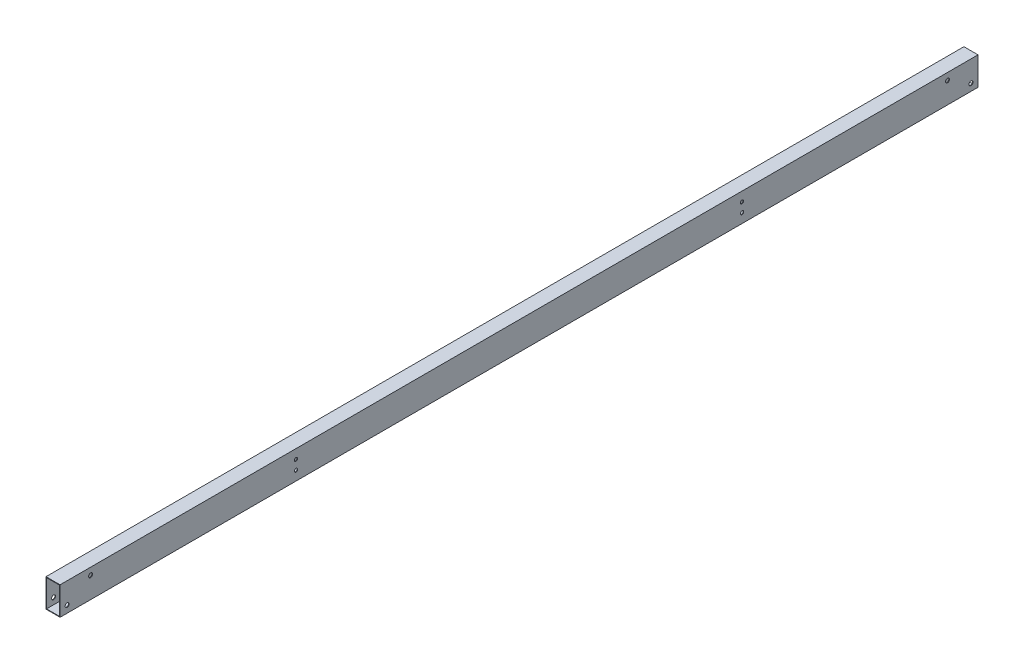
ISO-10303-21;
HEADER;
FILE_DESCRIPTION(('STEP AP214'),'2;1');
FILE_NAME('part.step','',(''),(''),'','','');
FILE_SCHEMA(('AUTOMOTIVE_DESIGN { 1 0 10303 214 1 1 1 1 }'));
ENDSEC;
DATA;
#1=APPLICATION_CONTEXT('core data for automotive mechanical design processes');
#2=APPLICATION_PROTOCOL_DEFINITION('international standard','automotive_design',2000,#1);
#3=PRODUCT_CONTEXT('',#1,'mechanical');
#4=PRODUCT('Part','Part','',(#3));
#5=PRODUCT_RELATED_PRODUCT_CATEGORY('part','',(#4));
#6=PRODUCT_DEFINITION_FORMATION('','',#4);
#7=PRODUCT_DEFINITION_CONTEXT('part definition',#1,'design');
#8=PRODUCT_DEFINITION('design','',#6,#7);
#9=PRODUCT_DEFINITION_SHAPE('','',#8);
#10=(LENGTH_UNIT() NAMED_UNIT(*) SI_UNIT(.MILLI.,.METRE.));
#11=(NAMED_UNIT(*) PLANE_ANGLE_UNIT() SI_UNIT($,.RADIAN.));
#12=(NAMED_UNIT(*) SI_UNIT($,.STERADIAN.) SOLID_ANGLE_UNIT());
#13=UNCERTAINTY_MEASURE_WITH_UNIT(LENGTH_MEASURE(1.E-05),#10,'distance_accuracy_value','');
#14=(GEOMETRIC_REPRESENTATION_CONTEXT(3) GLOBAL_UNCERTAINTY_ASSIGNED_CONTEXT((#13)) GLOBAL_UNIT_ASSIGNED_CONTEXT((#10,
#11,#12)) REPRESENTATION_CONTEXT('',''));
#15=CARTESIAN_POINT('',(0.,0.,0.));
#16=DIRECTION('',(0.,0.,1.));
#17=DIRECTION('',(1.,0.,0.));
#18=AXIS2_PLACEMENT_3D('',#15,#16,#17);
#19=CARTESIAN_POINT('',(0.,0.,1955.));
#20=DIRECTION('',(0.,0.,-1.));
#21=DIRECTION('',(-1.,0.,0.));
#22=AXIS2_PLACEMENT_3D('',#19,#20,#21);
#23=PLANE('',#22);
#24=DIRECTION('',(0.,-1.,0.));
#25=VECTOR('',#24,1.);
#26=CARTESIAN_POINT('',(0.,0.,1955.));
#27=LINE('',#26,#25);
#28=CARTESIAN_POINT('',(0.,60.,1955.));
#29=VERTEX_POINT('',#28);
#30=CARTESIAN_POINT('',(0.,0.,1955.));
#31=VERTEX_POINT('',#30);
#32=EDGE_CURVE('E138',#29,#31,#27,.T.);
#33=ORIENTED_EDGE('',*,*,#32,.T.);
#34=DIRECTION('',(1.,0.,0.));
#35=VECTOR('',#34,1.);
#36=CARTESIAN_POINT('',(0.,0.,1955.));
#37=LINE('',#36,#35);
#38=CARTESIAN_POINT('',(30.,0.,1955.));
#39=VERTEX_POINT('',#38);
#40=EDGE_CURVE('E141',#31,#39,#37,.T.);
#41=ORIENTED_EDGE('',*,*,#40,.T.);
#42=DIRECTION('',(0.,1.,0.));
#43=VECTOR('',#42,1.);
#44=CARTESIAN_POINT('',(30.,0.,1955.));
#45=LINE('',#44,#43);
#46=CARTESIAN_POINT('',(30.,60.,1955.));
#47=VERTEX_POINT('',#46);
#48=EDGE_CURVE('E144',#39,#47,#45,.T.);
#49=ORIENTED_EDGE('',*,*,#48,.T.);
#50=DIRECTION('',(-1.,0.,0.));
#51=VECTOR('',#50,1.);
#52=CARTESIAN_POINT('',(0.,60.,1955.));
#53=LINE('',#52,#51);
#54=EDGE_CURVE('E146',#47,#29,#53,.T.);
#55=ORIENTED_EDGE('',*,*,#54,.T.);
#56=EDGE_LOOP('',(#33,#41,#49,#55));
#57=FACE_BOUND('',#56,.T.);
#58=DIRECTION('',(0.,-1.,0.));
#59=VECTOR('',#58,1.);
#60=CARTESIAN_POINT('',(1.2,1.2,1955.));
#61=LINE('',#60,#59);
#62=CARTESIAN_POINT('',(1.2,58.8,1955.));
#63=VERTEX_POINT('',#62);
#64=CARTESIAN_POINT('',(1.2,1.2,1955.));
#65=VERTEX_POINT('',#64);
#66=EDGE_CURVE('E100',#63,#65,#61,.T.);
#67=ORIENTED_EDGE('',*,*,#66,.F.);
#68=DIRECTION('',(-1.,0.,0.));
#69=VECTOR('',#68,1.);
#70=CARTESIAN_POINT('',(1.2,58.8,1955.));
#71=LINE('',#70,#69);
#72=CARTESIAN_POINT('',(28.8,58.8,1955.));
#73=VERTEX_POINT('',#72);
#74=EDGE_CURVE('E122',#73,#63,#71,.T.);
#75=ORIENTED_EDGE('',*,*,#74,.F.);
#76=DIRECTION('',(0.,1.,0.));
#77=VECTOR('',#76,1.);
#78=CARTESIAN_POINT('',(28.8,1.2,1955.));
#79=LINE('',#78,#77);
#80=CARTESIAN_POINT('',(28.8,1.2,1955.));
#81=VERTEX_POINT('',#80);
#82=EDGE_CURVE('E120',#81,#73,#79,.T.);
#83=ORIENTED_EDGE('',*,*,#82,.F.);
#84=DIRECTION('',(1.,0.,0.));
#85=VECTOR('',#84,1.);
#86=CARTESIAN_POINT('',(1.2,1.2,1955.));
#87=LINE('',#86,#85);
#88=EDGE_CURVE('E108',#65,#81,#87,.T.);
#89=ORIENTED_EDGE('',*,*,#88,.F.);
#90=EDGE_LOOP('',(#67,#75,#83,#89));
#91=FACE_BOUND('',#90,.T.);
#92=ADVANCED_FACE('F33',(#57,#91),#23,.F.);
#93=CARTESIAN_POINT('',(0.,0.,0.));
#94=DIRECTION('',(0.,0.,-1.));
#95=DIRECTION('',(-1.,0.,0.));
#96=AXIS2_PLACEMENT_3D('',#93,#94,#95);
#97=PLANE('',#96);
#98=DIRECTION('',(0.,-1.,0.));
#99=VECTOR('',#98,1.);
#100=CARTESIAN_POINT('',(0.,0.,0.));
#101=LINE('',#100,#99);
#102=CARTESIAN_POINT('',(0.,60.,0.));
#103=VERTEX_POINT('',#102);
#104=CARTESIAN_POINT('',(0.,0.,0.));
#105=VERTEX_POINT('',#104);
#106=EDGE_CURVE('E116',#103,#105,#101,.T.);
#107=ORIENTED_EDGE('',*,*,#106,.F.);
#108=DIRECTION('',(-1.,0.,0.));
#109=VECTOR('',#108,1.);
#110=CARTESIAN_POINT('',(0.,60.,0.));
#111=LINE('',#110,#109);
#112=CARTESIAN_POINT('',(30.,60.,0.));
#113=VERTEX_POINT('',#112);
#114=EDGE_CURVE('E142',#113,#103,#111,.T.);
#115=ORIENTED_EDGE('',*,*,#114,.F.);
#116=DIRECTION('',(0.,1.,0.));
#117=VECTOR('',#116,1.);
#118=CARTESIAN_POINT('',(30.,0.,0.));
#119=LINE('',#118,#117);
#120=CARTESIAN_POINT('',(30.,0.,0.));
#121=VERTEX_POINT('',#120);
#122=EDGE_CURVE('E153',#121,#113,#119,.T.);
#123=ORIENTED_EDGE('',*,*,#122,.F.);
#124=DIRECTION('',(1.,0.,0.));
#125=VECTOR('',#124,1.);
#126=CARTESIAN_POINT('',(0.,0.,0.));
#127=LINE('',#126,#125);
#128=EDGE_CURVE('E151',#105,#121,#127,.T.);
#129=ORIENTED_EDGE('',*,*,#128,.F.);
#130=EDGE_LOOP('',(#107,#115,#123,#129));
#131=FACE_BOUND('',#130,.T.);
#132=DIRECTION('',(-1.,0.,0.));
#133=VECTOR('',#132,1.);
#134=CARTESIAN_POINT('',(1.2,58.8,0.));
#135=LINE('',#134,#133);
#136=CARTESIAN_POINT('',(28.8,58.8,0.));
#137=VERTEX_POINT('',#136);
#138=CARTESIAN_POINT('',(1.2,58.8,0.));
#139=VERTEX_POINT('',#138);
#140=EDGE_CURVE('E109',#137,#139,#135,.T.);
#141=ORIENTED_EDGE('',*,*,#140,.T.);
#142=DIRECTION('',(0.,-1.,0.));
#143=VECTOR('',#142,1.);
#144=CARTESIAN_POINT('',(1.2,1.2,0.));
#145=LINE('',#144,#143);
#146=CARTESIAN_POINT('',(1.2,1.2,0.));
#147=VERTEX_POINT('',#146);
#148=EDGE_CURVE('E58',#139,#147,#145,.T.);
#149=ORIENTED_EDGE('',*,*,#148,.T.);
#150=DIRECTION('',(1.,0.,0.));
#151=VECTOR('',#150,1.);
#152=CARTESIAN_POINT('',(1.2,1.2,0.));
#153=LINE('',#152,#151);
#154=CARTESIAN_POINT('',(28.8,1.2,0.));
#155=VERTEX_POINT('',#154);
#156=EDGE_CURVE('E115',#147,#155,#153,.T.);
#157=ORIENTED_EDGE('',*,*,#156,.T.);
#158=DIRECTION('',(0.,1.,0.));
#159=VECTOR('',#158,1.);
#160=CARTESIAN_POINT('',(28.8,1.2,0.));
#161=LINE('',#160,#159);
#162=EDGE_CURVE('E130',#155,#137,#161,.T.);
#163=ORIENTED_EDGE('',*,*,#162,.T.);
#164=EDGE_LOOP('',(#141,#149,#157,#163));
#165=FACE_BOUND('',#164,.T.);
#166=ADVANCED_FACE('F264',(#131,#165),#97,.T.);
#167=CARTESIAN_POINT('',(0.,0.,1955.));
#168=DIRECTION('',(1.,0.,0.));
#169=DIRECTION('',(0.,0.,-1.));
#170=AXIS2_PLACEMENT_3D('',#167,#168,#169);
#171=PLANE('',#170);
#172=CARTESIAN_POINT('',(0.,45.,65.));
#173=DIRECTION('',(1.,0.,0.));
#174=DIRECTION('',(0.,0.,-1.));
#175=AXIS2_PLACEMENT_3D('',#172,#173,#174);
#176=CIRCLE('',#175,4.25000000000001);
#177=CARTESIAN_POINT('',(0.,45.,60.75));
#178=VERTEX_POINT('',#177);
#179=EDGE_CURVE('E188',#178,#178,#176,.T.);
#180=ORIENTED_EDGE('',*,*,#179,.T.);
#181=EDGE_LOOP('',(#180));
#182=FACE_BOUND('',#181,.T.);
#183=CARTESIAN_POINT('',(0.,45.,1890.));
#184=DIRECTION('',(1.,0.,0.));
#185=DIRECTION('',(0.,0.,-1.));
#186=AXIS2_PLACEMENT_3D('',#183,#184,#185);
#187=CIRCLE('',#186,4.25000000000001);
#188=CARTESIAN_POINT('',(0.,45.,1885.75));
#189=VERTEX_POINT('',#188);
#190=EDGE_CURVE('E358',#189,#189,#187,.T.);
#191=ORIENTED_EDGE('',*,*,#190,.T.);
#192=EDGE_LOOP('',(#191));
#193=FACE_BOUND('',#192,.T.);
#194=CARTESIAN_POINT('',(0.,15.,1940.));
#195=DIRECTION('',(1.,0.,0.));
#196=DIRECTION('',(0.,0.,-1.));
#197=AXIS2_PLACEMENT_3D('',#194,#195,#196);
#198=CIRCLE('',#197,4.25000000000001);
#199=CARTESIAN_POINT('',(0.,15.,1935.75));
#200=VERTEX_POINT('',#199);
#201=EDGE_CURVE('E365',#200,#200,#198,.T.);
#202=ORIENTED_EDGE('',*,*,#201,.T.);
#203=EDGE_LOOP('',(#202));
#204=FACE_BOUND('',#203,.T.);
#205=CARTESIAN_POINT('',(0.,15.,15.));
#206=DIRECTION('',(1.,0.,0.));
#207=DIRECTION('',(0.,0.,-1.));
#208=AXIS2_PLACEMENT_3D('',#205,#206,#207);
#209=CIRCLE('',#208,4.25);
#210=CARTESIAN_POINT('',(0.,15.,10.75));
#211=VERTEX_POINT('',#210);
#212=EDGE_CURVE('E184',#211,#211,#209,.T.);
#213=ORIENTED_EDGE('',*,*,#212,.T.);
#214=EDGE_LOOP('',(#213));
#215=FACE_BOUND('',#214,.T.);
#216=CARTESIAN_POINT('',(0.,19.9999999999996,1452.5));
#217=DIRECTION('',(1.,0.,0.));
#218=DIRECTION('',(0.,0.,-1.));
#219=AXIS2_PLACEMENT_3D('',#216,#217,#218);
#220=CIRCLE('',#219,3.49999999999974);
#221=CARTESIAN_POINT('',(0.,19.9999999999996,1449.));
#222=VERTEX_POINT('',#221);
#223=EDGE_CURVE('E171',#222,#222,#220,.T.);
#224=ORIENTED_EDGE('',*,*,#223,.T.);
#225=EDGE_LOOP('',(#224));
#226=FACE_BOUND('',#225,.T.);
#227=CARTESIAN_POINT('',(0.,39.9999999999998,502.5));
#228=DIRECTION('',(1.,0.,0.));
#229=DIRECTION('',(0.,0.,-1.));
#230=AXIS2_PLACEMENT_3D('',#227,#228,#229);
#231=CIRCLE('',#230,3.49999999999996);
#232=CARTESIAN_POINT('',(0.,39.9999999999998,499.));
#233=VERTEX_POINT('',#232);
#234=EDGE_CURVE('E220',#233,#233,#231,.T.);
#235=ORIENTED_EDGE('',*,*,#234,.T.);
#236=EDGE_LOOP('',(#235));
#237=FACE_BOUND('',#236,.T.);
#238=CARTESIAN_POINT('',(0.,19.9999999999998,502.5));
#239=DIRECTION('',(1.,0.,0.));
#240=DIRECTION('',(0.,0.,-1.));
#241=AXIS2_PLACEMENT_3D('',#238,#239,#240);
#242=CIRCLE('',#241,3.49999999999996);
#243=CARTESIAN_POINT('',(0.,19.9999999999998,499.));
#244=VERTEX_POINT('',#243);
#245=EDGE_CURVE('E226',#244,#244,#242,.T.);
#246=ORIENTED_EDGE('',*,*,#245,.T.);
#247=EDGE_LOOP('',(#246));
#248=FACE_BOUND('',#247,.T.);
#249=CARTESIAN_POINT('',(0.,39.9999999999996,1452.5));
#250=DIRECTION('',(1.,0.,0.));
#251=DIRECTION('',(0.,0.,-1.));
#252=AXIS2_PLACEMENT_3D('',#249,#250,#251);
#253=CIRCLE('',#252,3.49999999999974);
#254=CARTESIAN_POINT('',(0.,39.9999999999996,1449.));
#255=VERTEX_POINT('',#254);
#256=EDGE_CURVE('E166',#255,#255,#253,.T.);
#257=ORIENTED_EDGE('',*,*,#256,.T.);
#258=EDGE_LOOP('',(#257));
#259=FACE_BOUND('',#258,.T.);
#260=ORIENTED_EDGE('',*,*,#106,.T.);
#261=DIRECTION('',(0.,0.,-1.));
#262=VECTOR('',#261,1.);
#263=CARTESIAN_POINT('',(0.,0.,1955.));
#264=LINE('',#263,#262);
#265=EDGE_CURVE('E11',#31,#105,#264,.T.);
#266=ORIENTED_EDGE('',*,*,#265,.F.);
#267=ORIENTED_EDGE('',*,*,#32,.F.);
#268=DIRECTION('',(0.,0.,-1.));
#269=VECTOR('',#268,1.);
#270=CARTESIAN_POINT('',(0.,60.,1955.));
#271=LINE('',#270,#269);
#272=EDGE_CURVE('E148',#29,#103,#271,.T.);
#273=ORIENTED_EDGE('',*,*,#272,.T.);
#274=EDGE_LOOP('',(#260,#266,#267,#273));
#275=FACE_BOUND('',#274,.T.);
#276=ADVANCED_FACE('F35',(#182,#193,#204,#215,#226,#237,#248,#259,#275),#171,.F.);
#277=CARTESIAN_POINT('',(0.,0.,1955.));
#278=DIRECTION('',(0.,1.,0.));
#279=DIRECTION('',(0.,0.,1.));
#280=AXIS2_PLACEMENT_3D('',#277,#278,#279);
#281=PLANE('',#280);
#282=ORIENTED_EDGE('',*,*,#128,.T.);
#283=DIRECTION('',(0.,0.,-1.));
#284=VECTOR('',#283,1.);
#285=CARTESIAN_POINT('',(30.,0.,1955.));
#286=LINE('',#285,#284);
#287=EDGE_CURVE('E42',#39,#121,#286,.T.);
#288=ORIENTED_EDGE('',*,*,#287,.F.);
#289=ORIENTED_EDGE('',*,*,#40,.F.);
#290=ORIENTED_EDGE('',*,*,#265,.T.);
#291=EDGE_LOOP('',(#282,#288,#289,#290));
#292=FACE_BOUND('',#291,.T.);
#293=ADVANCED_FACE('F273',(#292),#281,.F.);
#294=CARTESIAN_POINT('',(30.,0.,1955.));
#295=DIRECTION('',(-1.,0.,0.));
#296=DIRECTION('',(0.,0.,1.));
#297=AXIS2_PLACEMENT_3D('',#294,#295,#296);
#298=PLANE('',#297);
#299=CARTESIAN_POINT('',(30.,45.,65.));
#300=DIRECTION('',(1.,0.,0.));
#301=DIRECTION('',(0.,0.,-1.));
#302=AXIS2_PLACEMENT_3D('',#299,#300,#301);
#303=CIRCLE('',#302,4.25000000000001);
#304=CARTESIAN_POINT('',(30.,45.,60.75));
#305=VERTEX_POINT('',#304);
#306=EDGE_CURVE('E355',#305,#305,#303,.T.);
#307=ORIENTED_EDGE('',*,*,#306,.F.);
#308=EDGE_LOOP('',(#307));
#309=FACE_BOUND('',#308,.T.);
#310=CARTESIAN_POINT('',(30.,45.,1890.));
#311=DIRECTION('',(1.,0.,0.));
#312=DIRECTION('',(0.,0.,-1.));
#313=AXIS2_PLACEMENT_3D('',#310,#311,#312);
#314=CIRCLE('',#313,4.25000000000001);
#315=CARTESIAN_POINT('',(30.,45.,1885.75));
#316=VERTEX_POINT('',#315);
#317=EDGE_CURVE('E363',#316,#316,#314,.T.);
#318=ORIENTED_EDGE('',*,*,#317,.F.);
#319=EDGE_LOOP('',(#318));
#320=FACE_BOUND('',#319,.T.);
#321=CARTESIAN_POINT('',(30.,15.,1940.));
#322=DIRECTION('',(1.,0.,0.));
#323=DIRECTION('',(0.,0.,-1.));
#324=AXIS2_PLACEMENT_3D('',#321,#322,#323);
#325=CIRCLE('',#324,4.25000000000001);
#326=CARTESIAN_POINT('',(30.,15.,1935.75));
#327=VERTEX_POINT('',#326);
#328=EDGE_CURVE('E201',#327,#327,#325,.T.);
#329=ORIENTED_EDGE('',*,*,#328,.F.);
#330=EDGE_LOOP('',(#329));
#331=FACE_BOUND('',#330,.T.);
#332=CARTESIAN_POINT('',(30.,15.,15.));
#333=DIRECTION('',(1.,0.,0.));
#334=DIRECTION('',(0.,0.,-1.));
#335=AXIS2_PLACEMENT_3D('',#332,#333,#334);
#336=CIRCLE('',#335,4.25);
#337=CARTESIAN_POINT('',(30.,15.,10.75));
#338=VERTEX_POINT('',#337);
#339=EDGE_CURVE('E207',#338,#338,#336,.T.);
#340=ORIENTED_EDGE('',*,*,#339,.F.);
#341=EDGE_LOOP('',(#340));
#342=FACE_BOUND('',#341,.T.);
#343=CARTESIAN_POINT('',(30.,19.9999999999996,1452.5));
#344=DIRECTION('',(1.,0.,0.));
#345=DIRECTION('',(0.,0.,-1.));
#346=AXIS2_PLACEMENT_3D('',#343,#344,#345);
#347=CIRCLE('',#346,3.49999999999974);
#348=CARTESIAN_POINT('',(30.,19.9999999999996,1449.));
#349=VERTEX_POINT('',#348);
#350=EDGE_CURVE('E217',#349,#349,#347,.T.);
#351=ORIENTED_EDGE('',*,*,#350,.F.);
#352=EDGE_LOOP('',(#351));
#353=FACE_BOUND('',#352,.T.);
#354=CARTESIAN_POINT('',(30.,39.9999999999998,502.5));
#355=DIRECTION('',(1.,0.,0.));
#356=DIRECTION('',(0.,0.,-1.));
#357=AXIS2_PLACEMENT_3D('',#354,#355,#356);
#358=CIRCLE('',#357,3.49999999999996);
#359=CARTESIAN_POINT('',(30.,39.9999999999998,499.));
#360=VERTEX_POINT('',#359);
#361=EDGE_CURVE('E223',#360,#360,#358,.T.);
#362=ORIENTED_EDGE('',*,*,#361,.F.);
#363=EDGE_LOOP('',(#362));
#364=FACE_BOUND('',#363,.T.);
#365=CARTESIAN_POINT('',(30.,19.9999999999998,502.5));
#366=DIRECTION('',(1.,0.,0.));
#367=DIRECTION('',(0.,0.,-1.));
#368=AXIS2_PLACEMENT_3D('',#365,#366,#367);
#369=CIRCLE('',#368,3.49999999999996);
#370=CARTESIAN_POINT('',(30.,19.9999999999998,499.));
#371=VERTEX_POINT('',#370);
#372=EDGE_CURVE('E214',#371,#371,#369,.T.);
#373=ORIENTED_EDGE('',*,*,#372,.F.);
#374=EDGE_LOOP('',(#373));
#375=FACE_BOUND('',#374,.T.);
#376=CARTESIAN_POINT('',(30.,39.9999999999996,1452.5));
#377=DIRECTION('',(1.,0.,0.));
#378=DIRECTION('',(0.,0.,-1.));
#379=AXIS2_PLACEMENT_3D('',#376,#377,#378);
#380=CIRCLE('',#379,3.49999999999974);
#381=CARTESIAN_POINT('',(30.,39.9999999999996,1449.));
#382=VERTEX_POINT('',#381);
#383=EDGE_CURVE('E237',#382,#382,#380,.T.);
#384=ORIENTED_EDGE('',*,*,#383,.F.);
#385=EDGE_LOOP('',(#384));
#386=FACE_BOUND('',#385,.T.);
#387=ORIENTED_EDGE('',*,*,#122,.T.);
#388=DIRECTION('',(0.,0.,-1.));
#389=VECTOR('',#388,1.);
#390=CARTESIAN_POINT('',(30.,60.,1955.));
#391=LINE('',#390,#389);
#392=EDGE_CURVE('E158',#47,#113,#391,.T.);
#393=ORIENTED_EDGE('',*,*,#392,.F.);
#394=ORIENTED_EDGE('',*,*,#48,.F.);
#395=ORIENTED_EDGE('',*,*,#287,.T.);
#396=EDGE_LOOP('',(#387,#393,#394,#395));
#397=FACE_BOUND('',#396,.T.);
#398=ADVANCED_FACE('F257',(#309,#320,#331,#342,#353,#364,#375,#386,#397),#298,.F.);
#399=CARTESIAN_POINT('',(0.,60.,1955.));
#400=DIRECTION('',(0.,-1.,0.));
#401=DIRECTION('',(0.,0.,-1.));
#402=AXIS2_PLACEMENT_3D('',#399,#400,#401);
#403=PLANE('',#402);
#404=ORIENTED_EDGE('',*,*,#114,.T.);
#405=ORIENTED_EDGE('',*,*,#272,.F.);
#406=ORIENTED_EDGE('',*,*,#54,.F.);
#407=ORIENTED_EDGE('',*,*,#392,.T.);
#408=EDGE_LOOP('',(#404,#405,#406,#407));
#409=FACE_BOUND('',#408,.T.);
#410=ADVANCED_FACE('F248',(#409),#403,.F.);
#411=CARTESIAN_POINT('',(1.2,1.2,1955.));
#412=DIRECTION('',(1.,0.,0.));
#413=DIRECTION('',(0.,0.,-1.));
#414=AXIS2_PLACEMENT_3D('',#411,#412,#413);
#415=PLANE('',#414);
#416=CARTESIAN_POINT('',(1.2,45.,65.));
#417=DIRECTION('',(1.,0.,0.));
#418=DIRECTION('',(0.,0.,-1.));
#419=AXIS2_PLACEMENT_3D('',#416,#417,#418);
#420=CIRCLE('',#419,4.25000000000001);
#421=CARTESIAN_POINT('',(1.2,45.,60.75));
#422=VERTEX_POINT('',#421);
#423=EDGE_CURVE('E204',#422,#422,#420,.T.);
#424=ORIENTED_EDGE('',*,*,#423,.F.);
#425=EDGE_LOOP('',(#424));
#426=FACE_BOUND('',#425,.T.);
#427=CARTESIAN_POINT('',(1.2,45.,1890.));
#428=DIRECTION('',(1.,0.,0.));
#429=DIRECTION('',(0.,0.,-1.));
#430=AXIS2_PLACEMENT_3D('',#427,#428,#429);
#431=CIRCLE('',#430,4.25000000000001);
#432=CARTESIAN_POINT('',(1.2,45.,1885.75));
#433=VERTEX_POINT('',#432);
#434=EDGE_CURVE('E191',#433,#433,#431,.T.);
#435=ORIENTED_EDGE('',*,*,#434,.F.);
#436=EDGE_LOOP('',(#435));
#437=FACE_BOUND('',#436,.T.);
#438=CARTESIAN_POINT('',(1.2,15.,1940.));
#439=DIRECTION('',(1.,0.,0.));
#440=DIRECTION('',(0.,0.,-1.));
#441=AXIS2_PLACEMENT_3D('',#438,#439,#440);
#442=CIRCLE('',#441,4.25000000000001);
#443=CARTESIAN_POINT('',(1.2,15.,1935.75));
#444=VERTEX_POINT('',#443);
#445=EDGE_CURVE('E187',#444,#444,#442,.T.);
#446=ORIENTED_EDGE('',*,*,#445,.F.);
#447=EDGE_LOOP('',(#446));
#448=FACE_BOUND('',#447,.T.);
#449=CARTESIAN_POINT('',(1.2,15.,15.));
#450=DIRECTION('',(1.,0.,0.));
#451=DIRECTION('',(0.,0.,-1.));
#452=AXIS2_PLACEMENT_3D('',#449,#450,#451);
#453=CIRCLE('',#452,4.25);
#454=CARTESIAN_POINT('',(1.2,15.,10.75));
#455=VERTEX_POINT('',#454);
#456=EDGE_CURVE('E183',#455,#455,#453,.T.);
#457=ORIENTED_EDGE('',*,*,#456,.F.);
#458=EDGE_LOOP('',(#457));
#459=FACE_BOUND('',#458,.T.);
#460=CARTESIAN_POINT('',(1.2,19.9999999999996,1452.5));
#461=DIRECTION('',(1.,0.,0.));
#462=DIRECTION('',(0.,0.,-1.));
#463=AXIS2_PLACEMENT_3D('',#460,#461,#462);
#464=CIRCLE('',#463,3.49999999999974);
#465=CARTESIAN_POINT('',(1.2,19.9999999999996,1449.));
#466=VERTEX_POINT('',#465);
#467=EDGE_CURVE('E179',#466,#466,#464,.T.);
#468=ORIENTED_EDGE('',*,*,#467,.F.);
#469=EDGE_LOOP('',(#468));
#470=FACE_BOUND('',#469,.T.);
#471=CARTESIAN_POINT('',(1.2,39.9999999999998,502.5));
#472=DIRECTION('',(1.,0.,0.));
#473=DIRECTION('',(0.,0.,-1.));
#474=AXIS2_PLACEMENT_3D('',#471,#472,#473);
#475=CIRCLE('',#474,3.49999999999996);
#476=CARTESIAN_POINT('',(1.2,39.9999999999998,499.));
#477=VERTEX_POINT('',#476);
#478=EDGE_CURVE('E175',#477,#477,#475,.T.);
#479=ORIENTED_EDGE('',*,*,#478,.F.);
#480=EDGE_LOOP('',(#479));
#481=FACE_BOUND('',#480,.T.);
#482=CARTESIAN_POINT('',(1.2,19.9999999999998,502.5));
#483=DIRECTION('',(1.,0.,0.));
#484=DIRECTION('',(0.,0.,-1.));
#485=AXIS2_PLACEMENT_3D('',#482,#483,#484);
#486=CIRCLE('',#485,3.49999999999996);
#487=CARTESIAN_POINT('',(1.2,19.9999999999998,499.));
#488=VERTEX_POINT('',#487);
#489=EDGE_CURVE('E170',#488,#488,#486,.T.);
#490=ORIENTED_EDGE('',*,*,#489,.F.);
#491=EDGE_LOOP('',(#490));
#492=FACE_BOUND('',#491,.T.);
#493=CARTESIAN_POINT('',(1.2,39.9999999999996,1452.5));
#494=DIRECTION('',(1.,0.,0.));
#495=DIRECTION('',(0.,0.,-1.));
#496=AXIS2_PLACEMENT_3D('',#493,#494,#495);
#497=CIRCLE('',#496,3.49999999999974);
#498=CARTESIAN_POINT('',(1.2,39.9999999999996,1449.));
#499=VERTEX_POINT('',#498);
#500=EDGE_CURVE('E128',#499,#499,#497,.T.);
#501=ORIENTED_EDGE('',*,*,#500,.F.);
#502=EDGE_LOOP('',(#501));
#503=FACE_BOUND('',#502,.T.);
#504=ORIENTED_EDGE('',*,*,#148,.F.);
#505=DIRECTION('',(0.,0.,-1.));
#506=VECTOR('',#505,1.);
#507=CARTESIAN_POINT('',(1.2,58.8,1955.));
#508=LINE('',#507,#506);
#509=EDGE_CURVE('E104',#63,#139,#508,.T.);
#510=ORIENTED_EDGE('',*,*,#509,.F.);
#511=ORIENTED_EDGE('',*,*,#66,.T.);
#512=DIRECTION('',(0.,0.,-1.));
#513=VECTOR('',#512,1.);
#514=CARTESIAN_POINT('',(1.2,1.2,1955.));
#515=LINE('',#514,#513);
#516=EDGE_CURVE('E103',#65,#147,#515,.T.);
#517=ORIENTED_EDGE('',*,*,#516,.T.);
#518=EDGE_LOOP('',(#504,#510,#511,#517));
#519=FACE_BOUND('',#518,.T.);
#520=ADVANCED_FACE('F102',(#426,#437,#448,#459,#470,#481,#492,#503,#519),#415,.T.);
#521=CARTESIAN_POINT('',(1.2,1.2,1955.));
#522=DIRECTION('',(0.,1.,0.));
#523=DIRECTION('',(0.,0.,1.));
#524=AXIS2_PLACEMENT_3D('',#521,#522,#523);
#525=PLANE('',#524);
#526=ORIENTED_EDGE('',*,*,#156,.F.);
#527=ORIENTED_EDGE('',*,*,#516,.F.);
#528=ORIENTED_EDGE('',*,*,#88,.T.);
#529=DIRECTION('',(0.,0.,-1.));
#530=VECTOR('',#529,1.);
#531=CARTESIAN_POINT('',(28.8,1.2,1955.));
#532=LINE('',#531,#530);
#533=EDGE_CURVE('E117',#81,#155,#532,.T.);
#534=ORIENTED_EDGE('',*,*,#533,.T.);
#535=EDGE_LOOP('',(#526,#527,#528,#534));
#536=FACE_BOUND('',#535,.T.);
#537=ADVANCED_FACE('F112',(#536),#525,.T.);
#538=CARTESIAN_POINT('',(28.8,1.2,1955.));
#539=DIRECTION('',(-1.,0.,0.));
#540=DIRECTION('',(0.,0.,1.));
#541=AXIS2_PLACEMENT_3D('',#538,#539,#540);
#542=PLANE('',#541);
#543=CARTESIAN_POINT('',(28.8,45.,65.));
#544=DIRECTION('',(-1.,0.,0.));
#545=DIRECTION('',(0.,0.,1.));
#546=AXIS2_PLACEMENT_3D('',#543,#544,#545);
#547=CIRCLE('',#546,4.25000000000001);
#548=CARTESIAN_POINT('',(28.8,45.,69.25));
#549=VERTEX_POINT('',#548);
#550=EDGE_CURVE('E37',#549,#549,#547,.T.);
#551=ORIENTED_EDGE('',*,*,#550,.F.);
#552=EDGE_LOOP('',(#551));
#553=FACE_BOUND('',#552,.T.);
#554=CARTESIAN_POINT('',(28.8,45.,1890.));
#555=DIRECTION('',(-1.,0.,0.));
#556=DIRECTION('',(0.,0.,1.));
#557=AXIS2_PLACEMENT_3D('',#554,#555,#556);
#558=CIRCLE('',#557,4.25000000000001);
#559=CARTESIAN_POINT('',(28.8,45.,1894.25));
#560=VERTEX_POINT('',#559);
#561=EDGE_CURVE('E189',#560,#560,#558,.T.);
#562=ORIENTED_EDGE('',*,*,#561,.F.);
#563=EDGE_LOOP('',(#562));
#564=FACE_BOUND('',#563,.T.);
#565=CARTESIAN_POINT('',(28.8,15.,1940.));
#566=DIRECTION('',(-1.,0.,0.));
#567=DIRECTION('',(0.,0.,1.));
#568=AXIS2_PLACEMENT_3D('',#565,#566,#567);
#569=CIRCLE('',#568,4.25000000000001);
#570=CARTESIAN_POINT('',(28.8,15.,1944.25));
#571=VERTEX_POINT('',#570);
#572=EDGE_CURVE('E185',#571,#571,#569,.T.);
#573=ORIENTED_EDGE('',*,*,#572,.F.);
#574=EDGE_LOOP('',(#573));
#575=FACE_BOUND('',#574,.T.);
#576=CARTESIAN_POINT('',(28.8,15.,15.));
#577=DIRECTION('',(-1.,0.,0.));
#578=DIRECTION('',(0.,0.,1.));
#579=AXIS2_PLACEMENT_3D('',#576,#577,#578);
#580=CIRCLE('',#579,4.25);
#581=CARTESIAN_POINT('',(28.8,15.,19.25));
#582=VERTEX_POINT('',#581);
#583=EDGE_CURVE('E180',#582,#582,#580,.T.);
#584=ORIENTED_EDGE('',*,*,#583,.F.);
#585=EDGE_LOOP('',(#584));
#586=FACE_BOUND('',#585,.T.);
#587=CARTESIAN_POINT('',(28.8,19.9999999999996,1452.5));
#588=DIRECTION('',(-1.,0.,0.));
#589=DIRECTION('',(0.,0.,1.));
#590=AXIS2_PLACEMENT_3D('',#587,#588,#589);
#591=CIRCLE('',#590,3.49999999999974);
#592=CARTESIAN_POINT('',(28.8,19.9999999999996,1456.));
#593=VERTEX_POINT('',#592);
#594=EDGE_CURVE('E176',#593,#593,#591,.T.);
#595=ORIENTED_EDGE('',*,*,#594,.F.);
#596=EDGE_LOOP('',(#595));
#597=FACE_BOUND('',#596,.T.);
#598=CARTESIAN_POINT('',(28.8,39.9999999999998,502.5));
#599=DIRECTION('',(-1.,0.,0.));
#600=DIRECTION('',(0.,0.,1.));
#601=AXIS2_PLACEMENT_3D('',#598,#599,#600);
#602=CIRCLE('',#601,3.49999999999996);
#603=CARTESIAN_POINT('',(28.8,39.9999999999998,506.));
#604=VERTEX_POINT('',#603);
#605=EDGE_CURVE('E172',#604,#604,#602,.T.);
#606=ORIENTED_EDGE('',*,*,#605,.F.);
#607=EDGE_LOOP('',(#606));
#608=FACE_BOUND('',#607,.T.);
#609=CARTESIAN_POINT('',(28.8,19.9999999999998,502.5));
#610=DIRECTION('',(-1.,0.,0.));
#611=DIRECTION('',(0.,0.,1.));
#612=AXIS2_PLACEMENT_3D('',#609,#610,#611);
#613=CIRCLE('',#612,3.49999999999996);
#614=CARTESIAN_POINT('',(28.8,19.9999999999998,506.));
#615=VERTEX_POINT('',#614);
#616=EDGE_CURVE('E167',#615,#615,#613,.T.);
#617=ORIENTED_EDGE('',*,*,#616,.F.);
#618=EDGE_LOOP('',(#617));
#619=FACE_BOUND('',#618,.T.);
#620=CARTESIAN_POINT('',(28.8,39.9999999999996,1452.5));
#621=DIRECTION('',(-1.,0.,0.));
#622=DIRECTION('',(0.,0.,1.));
#623=AXIS2_PLACEMENT_3D('',#620,#621,#622);
#624=CIRCLE('',#623,3.49999999999974);
#625=CARTESIAN_POINT('',(28.8,39.9999999999996,1456.));
#626=VERTEX_POINT('',#625);
#627=EDGE_CURVE('E163',#626,#626,#624,.T.);
#628=ORIENTED_EDGE('',*,*,#627,.F.);
#629=EDGE_LOOP('',(#628));
#630=FACE_BOUND('',#629,.T.);
#631=ORIENTED_EDGE('',*,*,#162,.F.);
#632=ORIENTED_EDGE('',*,*,#533,.F.);
#633=ORIENTED_EDGE('',*,*,#82,.T.);
#634=DIRECTION('',(0.,0.,-1.));
#635=VECTOR('',#634,1.);
#636=CARTESIAN_POINT('',(28.8,58.8,1955.));
#637=LINE('',#636,#635);
#638=EDGE_CURVE('E50',#73,#137,#637,.T.);
#639=ORIENTED_EDGE('',*,*,#638,.T.);
#640=EDGE_LOOP('',(#631,#632,#633,#639));
#641=FACE_BOUND('',#640,.T.);
#642=ADVANCED_FACE('F255',(#553,#564,#575,#586,#597,#608,#619,#630,#641),#542,.T.);
#643=CARTESIAN_POINT('',(1.2,58.8,1955.));
#644=DIRECTION('',(0.,-1.,0.));
#645=DIRECTION('',(0.,0.,-1.));
#646=AXIS2_PLACEMENT_3D('',#643,#644,#645);
#647=PLANE('',#646);
#648=ORIENTED_EDGE('',*,*,#140,.F.);
#649=ORIENTED_EDGE('',*,*,#638,.F.);
#650=ORIENTED_EDGE('',*,*,#74,.T.);
#651=ORIENTED_EDGE('',*,*,#509,.T.);
#652=EDGE_LOOP('',(#648,#649,#650,#651));
#653=FACE_BOUND('',#652,.T.);
#654=ADVANCED_FACE('F295',(#653),#647,.T.);
#655=CARTESIAN_POINT('',(0.,39.9999999999996,1452.5));
#656=DIRECTION('',(1.,0.,0.));
#657=DIRECTION('',(0.,0.,-1.));
#658=AXIS2_PLACEMENT_3D('',#655,#656,#657);
#659=CYLINDRICAL_SURFACE('',#658,3.49999999999974);
#660=ORIENTED_EDGE('',*,*,#627,.T.);
#661=EDGE_LOOP('',(#660));
#662=FACE_BOUND('',#661,.T.);
#663=ORIENTED_EDGE('',*,*,#383,.T.);
#664=EDGE_LOOP('',(#663));
#665=FACE_BOUND('',#664,.T.);
#666=ADVANCED_FACE('F297',(#662,#665),#659,.F.);
#667=ORIENTED_EDGE('',*,*,#500,.T.);
#668=EDGE_LOOP('',(#667));
#669=FACE_BOUND('',#668,.T.);
#670=ORIENTED_EDGE('',*,*,#256,.F.);
#671=EDGE_LOOP('',(#670));
#672=FACE_BOUND('',#671,.T.);
#673=ADVANCED_FACE('F244',(#669,#672),#659,.F.);
#674=CARTESIAN_POINT('',(0.,19.9999999999998,502.5));
#675=DIRECTION('',(1.,0.,0.));
#676=DIRECTION('',(0.,0.,-1.));
#677=AXIS2_PLACEMENT_3D('',#674,#675,#676);
#678=CYLINDRICAL_SURFACE('',#677,3.49999999999996);
#679=ORIENTED_EDGE('',*,*,#616,.T.);
#680=EDGE_LOOP('',(#679));
#681=FACE_BOUND('',#680,.T.);
#682=ORIENTED_EDGE('',*,*,#372,.T.);
#683=EDGE_LOOP('',(#682));
#684=FACE_BOUND('',#683,.T.);
#685=ADVANCED_FACE('F308',(#681,#684),#678,.F.);
#686=CARTESIAN_POINT('',(0.,39.9999999999998,502.5));
#687=DIRECTION('',(1.,0.,0.));
#688=DIRECTION('',(0.,0.,-1.));
#689=AXIS2_PLACEMENT_3D('',#686,#687,#688);
#690=CYLINDRICAL_SURFACE('',#689,3.49999999999996);
#691=ORIENTED_EDGE('',*,*,#605,.T.);
#692=EDGE_LOOP('',(#691));
#693=FACE_BOUND('',#692,.T.);
#694=ORIENTED_EDGE('',*,*,#361,.T.);
#695=EDGE_LOOP('',(#694));
#696=FACE_BOUND('',#695,.T.);
#697=ADVANCED_FACE('F311',(#693,#696),#690,.F.);
#698=CARTESIAN_POINT('',(0.,19.9999999999996,1452.5));
#699=DIRECTION('',(1.,0.,0.));
#700=DIRECTION('',(0.,0.,-1.));
#701=AXIS2_PLACEMENT_3D('',#698,#699,#700);
#702=CYLINDRICAL_SURFACE('',#701,3.49999999999974);
#703=ORIENTED_EDGE('',*,*,#594,.T.);
#704=EDGE_LOOP('',(#703));
#705=FACE_BOUND('',#704,.T.);
#706=ORIENTED_EDGE('',*,*,#350,.T.);
#707=EDGE_LOOP('',(#706));
#708=FACE_BOUND('',#707,.T.);
#709=ADVANCED_FACE('F316',(#705,#708),#702,.F.);
#710=ORIENTED_EDGE('',*,*,#489,.T.);
#711=EDGE_LOOP('',(#710));
#712=FACE_BOUND('',#711,.T.);
#713=ORIENTED_EDGE('',*,*,#245,.F.);
#714=EDGE_LOOP('',(#713));
#715=FACE_BOUND('',#714,.T.);
#716=ADVANCED_FACE('F313',(#712,#715),#678,.F.);
#717=ORIENTED_EDGE('',*,*,#478,.T.);
#718=EDGE_LOOP('',(#717));
#719=FACE_BOUND('',#718,.T.);
#720=ORIENTED_EDGE('',*,*,#234,.F.);
#721=EDGE_LOOP('',(#720));
#722=FACE_BOUND('',#721,.T.);
#723=ADVANCED_FACE('F318',(#719,#722),#690,.F.);
#724=ORIENTED_EDGE('',*,*,#467,.T.);
#725=EDGE_LOOP('',(#724));
#726=FACE_BOUND('',#725,.T.);
#727=ORIENTED_EDGE('',*,*,#223,.F.);
#728=EDGE_LOOP('',(#727));
#729=FACE_BOUND('',#728,.T.);
#730=ADVANCED_FACE('F322',(#726,#729),#702,.F.);
#731=CARTESIAN_POINT('',(0.,15.,15.));
#732=DIRECTION('',(1.,0.,0.));
#733=DIRECTION('',(0.,0.,-1.));
#734=AXIS2_PLACEMENT_3D('',#731,#732,#733);
#735=CYLINDRICAL_SURFACE('',#734,4.25);
#736=ORIENTED_EDGE('',*,*,#583,.T.);
#737=EDGE_LOOP('',(#736));
#738=FACE_BOUND('',#737,.T.);
#739=ORIENTED_EDGE('',*,*,#339,.T.);
#740=EDGE_LOOP('',(#739));
#741=FACE_BOUND('',#740,.T.);
#742=ADVANCED_FACE('F323',(#738,#741),#735,.F.);
#743=ORIENTED_EDGE('',*,*,#456,.T.);
#744=EDGE_LOOP('',(#743));
#745=FACE_BOUND('',#744,.T.);
#746=ORIENTED_EDGE('',*,*,#212,.F.);
#747=EDGE_LOOP('',(#746));
#748=FACE_BOUND('',#747,.T.);
#749=ADVANCED_FACE('F326',(#745,#748),#735,.F.);
#750=CARTESIAN_POINT('',(0.,15.,1940.));
#751=DIRECTION('',(1.,0.,0.));
#752=DIRECTION('',(0.,0.,-1.));
#753=AXIS2_PLACEMENT_3D('',#750,#751,#752);
#754=CYLINDRICAL_SURFACE('',#753,4.25000000000001);
#755=ORIENTED_EDGE('',*,*,#572,.T.);
#756=EDGE_LOOP('',(#755));
#757=FACE_BOUND('',#756,.T.);
#758=ORIENTED_EDGE('',*,*,#328,.T.);
#759=EDGE_LOOP('',(#758));
#760=FACE_BOUND('',#759,.T.);
#761=ADVANCED_FACE('F328',(#757,#760),#754,.F.);
#762=CARTESIAN_POINT('',(0.,45.,1890.));
#763=DIRECTION('',(1.,0.,0.));
#764=DIRECTION('',(0.,0.,-1.));
#765=AXIS2_PLACEMENT_3D('',#762,#763,#764);
#766=CYLINDRICAL_SURFACE('',#765,4.25000000000001);
#767=ORIENTED_EDGE('',*,*,#561,.T.);
#768=EDGE_LOOP('',(#767));
#769=FACE_BOUND('',#768,.T.);
#770=ORIENTED_EDGE('',*,*,#317,.T.);
#771=EDGE_LOOP('',(#770));
#772=FACE_BOUND('',#771,.T.);
#773=ADVANCED_FACE('F331',(#769,#772),#766,.F.);
#774=CARTESIAN_POINT('',(0.,45.,65.));
#775=DIRECTION('',(1.,0.,0.));
#776=DIRECTION('',(0.,0.,-1.));
#777=AXIS2_PLACEMENT_3D('',#774,#775,#776);
#778=CYLINDRICAL_SURFACE('',#777,4.25000000000001);
#779=ORIENTED_EDGE('',*,*,#550,.T.);
#780=EDGE_LOOP('',(#779));
#781=FACE_BOUND('',#780,.T.);
#782=ORIENTED_EDGE('',*,*,#306,.T.);
#783=EDGE_LOOP('',(#782));
#784=FACE_BOUND('',#783,.T.);
#785=ADVANCED_FACE('F336',(#781,#784),#778,.F.);
#786=ORIENTED_EDGE('',*,*,#445,.T.);
#787=EDGE_LOOP('',(#786));
#788=FACE_BOUND('',#787,.T.);
#789=ORIENTED_EDGE('',*,*,#201,.F.);
#790=EDGE_LOOP('',(#789));
#791=FACE_BOUND('',#790,.T.);
#792=ADVANCED_FACE('F333',(#788,#791),#754,.F.);
#793=ORIENTED_EDGE('',*,*,#434,.T.);
#794=EDGE_LOOP('',(#793));
#795=FACE_BOUND('',#794,.T.);
#796=ORIENTED_EDGE('',*,*,#190,.F.);
#797=EDGE_LOOP('',(#796));
#798=FACE_BOUND('',#797,.T.);
#799=ADVANCED_FACE('F337',(#795,#798),#766,.F.);
#800=ORIENTED_EDGE('',*,*,#423,.T.);
#801=EDGE_LOOP('',(#800));
#802=FACE_BOUND('',#801,.T.);
#803=ORIENTED_EDGE('',*,*,#179,.F.);
#804=EDGE_LOOP('',(#803));
#805=FACE_BOUND('',#804,.T.);
#806=ADVANCED_FACE('F340',(#802,#805),#778,.F.);
#807=CLOSED_SHELL('',(#92,#166,#276,#293,#398,#410,#520,#537,#642,#654,#666,#673,#685,#697,#709,
#716,#723,#730,#742,#749,#761,#773,#785,#792,#799,#806));
#808=MANIFOLD_SOLID_BREP('B2',#807);
#809=ADVANCED_BREP_SHAPE_REPRESENTATION('',(#18,#808),#14);
#810=SHAPE_DEFINITION_REPRESENTATION(#9,#809);
ENDSEC;
END-ISO-10303-21;
